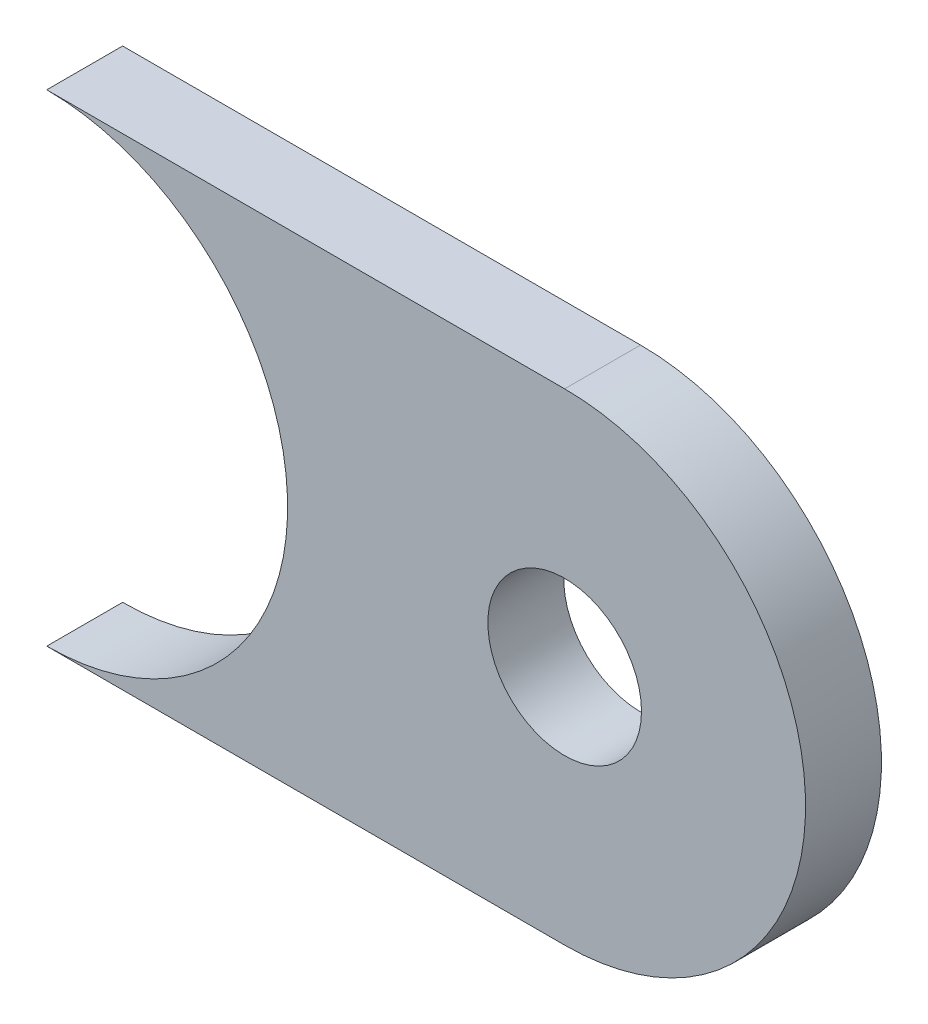
ISO-10303-21;
HEADER;
FILE_DESCRIPTION(('STEP AP214'),'2;1');
FILE_NAME('part.step','',(''),(''),'','','');
FILE_SCHEMA(('AUTOMOTIVE_DESIGN { 1 0 10303 214 1 1 1 1 }'));
ENDSEC;
DATA;
#1=APPLICATION_CONTEXT('core data for automotive mechanical design processes');
#2=APPLICATION_PROTOCOL_DEFINITION('international standard','automotive_design',2000,#1);
#3=PRODUCT_CONTEXT('',#1,'mechanical');
#4=PRODUCT('Part','Part','',(#3));
#5=PRODUCT_RELATED_PRODUCT_CATEGORY('part','',(#4));
#6=PRODUCT_DEFINITION_FORMATION('','',#4);
#7=PRODUCT_DEFINITION_CONTEXT('part definition',#1,'design');
#8=PRODUCT_DEFINITION('design','',#6,#7);
#9=PRODUCT_DEFINITION_SHAPE('','',#8);
#10=(LENGTH_UNIT() NAMED_UNIT(*) SI_UNIT(.MILLI.,.METRE.));
#11=(NAMED_UNIT(*) PLANE_ANGLE_UNIT() SI_UNIT($,.RADIAN.));
#12=(NAMED_UNIT(*) SI_UNIT($,.STERADIAN.) SOLID_ANGLE_UNIT());
#13=UNCERTAINTY_MEASURE_WITH_UNIT(LENGTH_MEASURE(1.E-05),#10,'distance_accuracy_value','');
#14=(GEOMETRIC_REPRESENTATION_CONTEXT(3) GLOBAL_UNCERTAINTY_ASSIGNED_CONTEXT((#13)) GLOBAL_UNIT_ASSIGNED_CONTEXT((#10,
#11,#12)) REPRESENTATION_CONTEXT('',''));
#15=CARTESIAN_POINT('',(0.,0.,0.));
#16=DIRECTION('',(0.,0.,1.));
#17=DIRECTION('',(1.,0.,0.));
#18=AXIS2_PLACEMENT_3D('',#15,#16,#17);
#19=CARTESIAN_POINT('',(0.,0.,4.));
#20=DIRECTION('',(0.,0.,1.));
#21=DIRECTION('',(1.,0.,0.));
#22=AXIS2_PLACEMENT_3D('',#19,#20,#21);
#23=PLANE('',#22);
#24=CARTESIAN_POINT('',(0.,0.,4.));
#25=DIRECTION('',(0.,0.,-1.));
#26=DIRECTION('',(1.,0.,0.));
#27=AXIS2_PLACEMENT_3D('',#24,#25,#26);
#28=CIRCLE('',#27,12.7);
#29=CARTESIAN_POINT('',(0.,12.7,4.));
#30=VERTEX_POINT('',#29);
#31=CARTESIAN_POINT('',(0.,-12.7,4.));
#32=VERTEX_POINT('',#31);
#33=EDGE_CURVE('E92',#30,#32,#28,.T.);
#34=ORIENTED_EDGE('',*,*,#33,.T.);
#35=DIRECTION('',(1.,0.,0.));
#36=VECTOR('',#35,1.);
#37=CARTESIAN_POINT('',(0.,-12.7,4.));
#38=LINE('',#37,#36);
#39=CARTESIAN_POINT('',(27.305,-12.7,4.));
#40=VERTEX_POINT('',#39);
#41=EDGE_CURVE('E87',#32,#40,#38,.T.);
#42=ORIENTED_EDGE('',*,*,#41,.T.);
#43=CARTESIAN_POINT('',(27.305,0.,4.));
#44=DIRECTION('',(0.,0.,1.));
#45=DIRECTION('',(1.,0.,0.));
#46=AXIS2_PLACEMENT_3D('',#43,#44,#45);
#47=CIRCLE('',#46,12.7);
#48=CARTESIAN_POINT('',(27.305,12.7,4.));
#49=VERTEX_POINT('',#48);
#50=EDGE_CURVE('E90',#40,#49,#47,.T.);
#51=ORIENTED_EDGE('',*,*,#50,.T.);
#52=DIRECTION('',(-1.,0.,0.));
#53=VECTOR('',#52,1.);
#54=CARTESIAN_POINT('',(0.,12.7,4.));
#55=LINE('',#54,#53);
#56=EDGE_CURVE('E57',#49,#30,#55,.T.);
#57=ORIENTED_EDGE('',*,*,#56,.T.);
#58=EDGE_LOOP('',(#34,#42,#51,#57));
#59=FACE_BOUND('',#58,.T.);
#60=CARTESIAN_POINT('',(27.305,0.,4.));
#61=DIRECTION('',(0.,0.,1.));
#62=DIRECTION('',(1.,0.,0.));
#63=AXIS2_PLACEMENT_3D('',#60,#61,#62);
#64=CIRCLE('',#63,4.05);
#65=CARTESIAN_POINT('',(31.355,0.,4.));
#66=VERTEX_POINT('',#65);
#67=EDGE_CURVE('E112',#66,#66,#64,.T.);
#68=ORIENTED_EDGE('',*,*,#67,.F.);
#69=EDGE_LOOP('',(#68));
#70=FACE_BOUND('',#69,.T.);
#71=ADVANCED_FACE('F39',(#59,#70),#23,.T.);
#72=CARTESIAN_POINT('',(0.,0.,0.));
#73=DIRECTION('',(0.,0.,1.));
#74=DIRECTION('',(1.,0.,0.));
#75=AXIS2_PLACEMENT_3D('',#72,#73,#74);
#76=PLANE('',#75);
#77=CARTESIAN_POINT('',(0.,0.,0.));
#78=DIRECTION('',(0.,0.,-1.));
#79=DIRECTION('',(1.,0.,0.));
#80=AXIS2_PLACEMENT_3D('',#77,#78,#79);
#81=CIRCLE('',#80,12.7);
#82=CARTESIAN_POINT('',(0.,12.7,0.));
#83=VERTEX_POINT('',#82);
#84=CARTESIAN_POINT('',(0.,-12.7,0.));
#85=VERTEX_POINT('',#84);
#86=EDGE_CURVE('E108',#83,#85,#81,.T.);
#87=ORIENTED_EDGE('',*,*,#86,.F.);
#88=DIRECTION('',(-1.,0.,0.));
#89=VECTOR('',#88,1.);
#90=CARTESIAN_POINT('',(0.,12.7,0.));
#91=LINE('',#90,#89);
#92=CARTESIAN_POINT('',(27.305,12.7,0.));
#93=VERTEX_POINT('',#92);
#94=EDGE_CURVE('E80',#93,#83,#91,.T.);
#95=ORIENTED_EDGE('',*,*,#94,.F.);
#96=CARTESIAN_POINT('',(27.305,0.,0.));
#97=DIRECTION('',(0.,0.,1.));
#98=DIRECTION('',(1.,0.,0.));
#99=AXIS2_PLACEMENT_3D('',#96,#97,#98);
#100=CIRCLE('',#99,12.7);
#101=CARTESIAN_POINT('',(27.305,-12.7,0.));
#102=VERTEX_POINT('',#101);
#103=EDGE_CURVE('E74',#102,#93,#100,.T.);
#104=ORIENTED_EDGE('',*,*,#103,.F.);
#105=DIRECTION('',(1.,0.,0.));
#106=VECTOR('',#105,1.);
#107=CARTESIAN_POINT('',(0.,-12.7,0.));
#108=LINE('',#107,#106);
#109=EDGE_CURVE('E97',#85,#102,#108,.T.);
#110=ORIENTED_EDGE('',*,*,#109,.F.);
#111=EDGE_LOOP('',(#87,#95,#104,#110));
#112=FACE_BOUND('',#111,.T.);
#113=CARTESIAN_POINT('',(27.305,0.,0.));
#114=DIRECTION('',(0.,0.,1.));
#115=DIRECTION('',(1.,0.,0.));
#116=AXIS2_PLACEMENT_3D('',#113,#114,#115);
#117=CIRCLE('',#116,4.05);
#118=CARTESIAN_POINT('',(31.355,0.,0.));
#119=VERTEX_POINT('',#118);
#120=EDGE_CURVE('E130',#119,#119,#117,.T.);
#121=ORIENTED_EDGE('',*,*,#120,.T.);
#122=EDGE_LOOP('',(#121));
#123=FACE_BOUND('',#122,.T.);
#124=ADVANCED_FACE('F125',(#112,#123),#76,.F.);
#125=CARTESIAN_POINT('',(0.,0.,4.));
#126=DIRECTION('',(0.,0.,-1.));
#127=DIRECTION('',(-1.,0.,0.));
#128=AXIS2_PLACEMENT_3D('',#125,#126,#127);
#129=CYLINDRICAL_SURFACE('',#128,12.7);
#130=ORIENTED_EDGE('',*,*,#86,.T.);
#131=DIRECTION('',(0.,0.,-1.));
#132=VECTOR('',#131,1.);
#133=CARTESIAN_POINT('',(0.,-12.7,4.));
#134=LINE('',#133,#132);
#135=EDGE_CURVE('E11',#32,#85,#134,.T.);
#136=ORIENTED_EDGE('',*,*,#135,.F.);
#137=ORIENTED_EDGE('',*,*,#33,.F.);
#138=DIRECTION('',(0.,0.,-1.));
#139=VECTOR('',#138,1.);
#140=CARTESIAN_POINT('',(0.,12.7,4.));
#141=LINE('',#140,#139);
#142=EDGE_CURVE('E104',#30,#83,#141,.T.);
#143=ORIENTED_EDGE('',*,*,#142,.T.);
#144=EDGE_LOOP('',(#130,#136,#137,#143));
#145=FACE_BOUND('',#144,.T.);
#146=ADVANCED_FACE('F41',(#145),#129,.F.);
#147=CARTESIAN_POINT('',(0.,-12.7,4.));
#148=DIRECTION('',(0.,1.,0.));
#149=DIRECTION('',(-1.,0.,0.));
#150=AXIS2_PLACEMENT_3D('',#147,#148,#149);
#151=PLANE('',#150);
#152=ORIENTED_EDGE('',*,*,#109,.T.);
#153=DIRECTION('',(0.,0.,-1.));
#154=VECTOR('',#153,1.);
#155=CARTESIAN_POINT('',(27.305,-12.7,4.));
#156=LINE('',#155,#154);
#157=EDGE_CURVE('E49',#40,#102,#156,.T.);
#158=ORIENTED_EDGE('',*,*,#157,.F.);
#159=ORIENTED_EDGE('',*,*,#41,.F.);
#160=ORIENTED_EDGE('',*,*,#135,.T.);
#161=EDGE_LOOP('',(#152,#158,#159,#160));
#162=FACE_BOUND('',#161,.T.);
#163=ADVANCED_FACE('F96',(#162),#151,.F.);
#164=CARTESIAN_POINT('',(27.305,0.,4.));
#165=DIRECTION('',(0.,0.,-1.));
#166=DIRECTION('',(-1.,0.,0.));
#167=AXIS2_PLACEMENT_3D('',#164,#165,#166);
#168=CYLINDRICAL_SURFACE('',#167,12.7);
#169=ORIENTED_EDGE('',*,*,#103,.T.);
#170=DIRECTION('',(0.,0.,-1.));
#171=VECTOR('',#170,1.);
#172=CARTESIAN_POINT('',(27.305,12.7,4.));
#173=LINE('',#172,#171);
#174=EDGE_CURVE('E99',#49,#93,#173,.T.);
#175=ORIENTED_EDGE('',*,*,#174,.F.);
#176=ORIENTED_EDGE('',*,*,#50,.F.);
#177=ORIENTED_EDGE('',*,*,#157,.T.);
#178=EDGE_LOOP('',(#169,#175,#176,#177));
#179=FACE_BOUND('',#178,.T.);
#180=ADVANCED_FACE('F100',(#179),#168,.T.);
#181=CARTESIAN_POINT('',(0.,12.7,4.));
#182=DIRECTION('',(0.,-1.,0.));
#183=DIRECTION('',(1.,0.,0.));
#184=AXIS2_PLACEMENT_3D('',#181,#182,#183);
#185=PLANE('',#184);
#186=ORIENTED_EDGE('',*,*,#94,.T.);
#187=ORIENTED_EDGE('',*,*,#142,.F.);
#188=ORIENTED_EDGE('',*,*,#56,.F.);
#189=ORIENTED_EDGE('',*,*,#174,.T.);
#190=EDGE_LOOP('',(#186,#187,#188,#189));
#191=FACE_BOUND('',#190,.T.);
#192=ADVANCED_FACE('F122',(#191),#185,.F.);
#193=CARTESIAN_POINT('',(27.305,0.,4.));
#194=DIRECTION('',(0.,0.,-1.));
#195=DIRECTION('',(-1.,0.,0.));
#196=AXIS2_PLACEMENT_3D('',#193,#194,#195);
#197=CYLINDRICAL_SURFACE('',#196,4.05);
#198=ORIENTED_EDGE('',*,*,#67,.T.);
#199=EDGE_LOOP('',(#198));
#200=FACE_BOUND('',#199,.T.);
#201=ORIENTED_EDGE('',*,*,#120,.F.);
#202=EDGE_LOOP('',(#201));
#203=FACE_BOUND('',#202,.T.);
#204=ADVANCED_FACE('F138',(#200,#203),#197,.F.);
#205=CLOSED_SHELL('',(#71,#124,#146,#163,#180,#192,#204));
#206=MANIFOLD_SOLID_BREP('B2',#205);
#207=ADVANCED_BREP_SHAPE_REPRESENTATION('',(#18,#206),#14);
#208=SHAPE_DEFINITION_REPRESENTATION(#9,#207);
ENDSEC;
END-ISO-10303-21;
